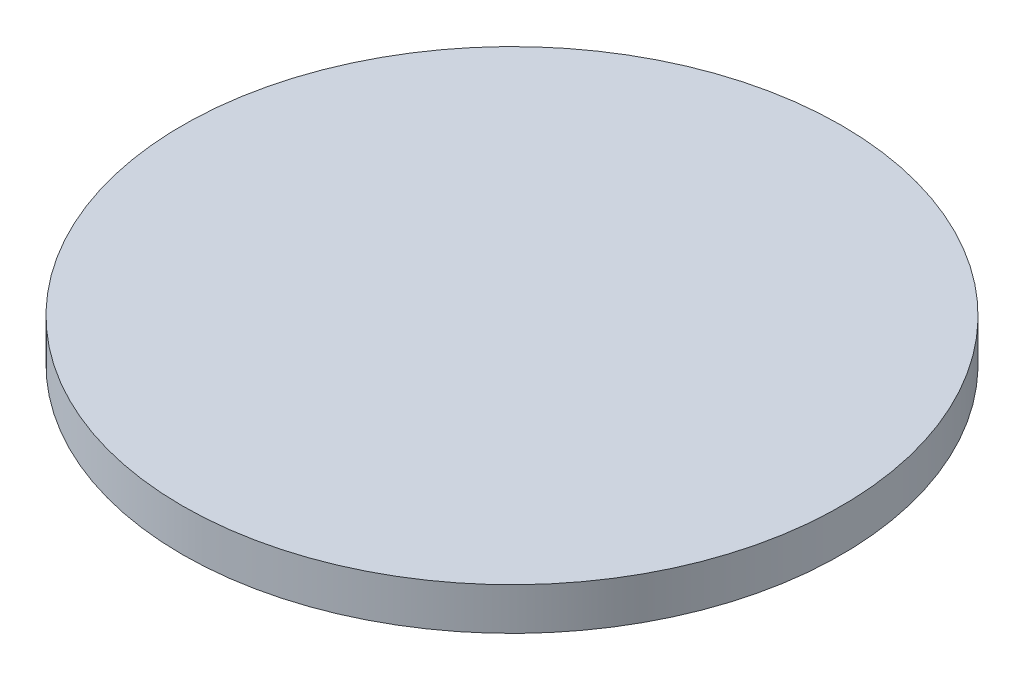
ISO-10303-21;
HEADER;
FILE_DESCRIPTION(('STEP AP214'),'2;1');
FILE_NAME('part.step','',(''),(''),'','','');
FILE_SCHEMA(('AUTOMOTIVE_DESIGN { 1 0 10303 214 1 1 1 1 }'));
ENDSEC;
DATA;
#1=APPLICATION_CONTEXT('core data for automotive mechanical design processes');
#2=APPLICATION_PROTOCOL_DEFINITION('international standard','automotive_design',2000,#1);
#3=PRODUCT_CONTEXT('',#1,'mechanical');
#4=PRODUCT('Part','Part','',(#3));
#5=PRODUCT_RELATED_PRODUCT_CATEGORY('part','',(#4));
#6=PRODUCT_DEFINITION_FORMATION('','',#4);
#7=PRODUCT_DEFINITION_CONTEXT('part definition',#1,'design');
#8=PRODUCT_DEFINITION('design','',#6,#7);
#9=PRODUCT_DEFINITION_SHAPE('','',#8);
#10=(LENGTH_UNIT() NAMED_UNIT(*) SI_UNIT(.MILLI.,.METRE.));
#11=(NAMED_UNIT(*) PLANE_ANGLE_UNIT() SI_UNIT($,.RADIAN.));
#12=(NAMED_UNIT(*) SI_UNIT($,.STERADIAN.) SOLID_ANGLE_UNIT());
#13=UNCERTAINTY_MEASURE_WITH_UNIT(LENGTH_MEASURE(1.E-05),#10,'distance_accuracy_value','');
#14=(GEOMETRIC_REPRESENTATION_CONTEXT(3) GLOBAL_UNCERTAINTY_ASSIGNED_CONTEXT((#13)) GLOBAL_UNIT_ASSIGNED_CONTEXT((#10,
#11,#12)) REPRESENTATION_CONTEXT('',''));
#15=CARTESIAN_POINT('',(0.,0.,0.));
#16=DIRECTION('',(0.,0.,1.));
#17=DIRECTION('',(1.,0.,0.));
#18=AXIS2_PLACEMENT_3D('',#15,#16,#17);
#19=CARTESIAN_POINT('',(0.,-5.,0.));
#20=DIRECTION('',(0.,1.,0.));
#21=DIRECTION('',(0.,0.,1.));
#22=AXIS2_PLACEMENT_3D('',#19,#20,#21);
#23=CYLINDRICAL_SURFACE('',#22,62.5);
#24=CARTESIAN_POINT('',(0.,-5.,0.));
#25=DIRECTION('',(0.,1.,0.));
#26=DIRECTION('',(0.,0.,1.));
#27=AXIS2_PLACEMENT_3D('',#24,#25,#26);
#28=CIRCLE('',#27,62.5);
#29=CARTESIAN_POINT('',(0.,-5.,62.5));
#30=VERTEX_POINT('',#29);
#31=EDGE_CURVE('E10',#30,#30,#28,.T.);
#32=ORIENTED_EDGE('',*,*,#31,.T.);
#33=EDGE_LOOP('',(#32));
#34=FACE_BOUND('',#33,.T.);
#35=CARTESIAN_POINT('',(0.,3.,0.));
#36=DIRECTION('',(0.,1.,0.));
#37=DIRECTION('',(0.,0.,1.));
#38=AXIS2_PLACEMENT_3D('',#35,#36,#37);
#39=CIRCLE('',#38,62.5);
#40=CARTESIAN_POINT('',(0.,3.,62.5));
#41=VERTEX_POINT('',#40);
#42=EDGE_CURVE('E51',#41,#41,#39,.T.);
#43=ORIENTED_EDGE('',*,*,#42,.F.);
#44=EDGE_LOOP('',(#43));
#45=FACE_BOUND('',#44,.T.);
#46=ADVANCED_FACE('F30',(#34,#45),#23,.T.);
#47=CARTESIAN_POINT('',(0.,-5.,0.));
#48=DIRECTION('',(0.,1.,0.));
#49=DIRECTION('',(0.,0.,1.));
#50=AXIS2_PLACEMENT_3D('',#47,#48,#49);
#51=PLANE('',#50);
#52=CARTESIAN_POINT('',(-22.041946960967,-5.,-30.3381372890583));
#53=DIRECTION('',(0.,1.,0.));
#54=DIRECTION('',(0.,0.,1.));
#55=AXIS2_PLACEMENT_3D('',#52,#53,#54);
#56=CIRCLE('',#55,11.25);
#57=CARTESIAN_POINT('',(-22.041946960967,-5.,-19.0881372890583));
#58=VERTEX_POINT('',#57);
#59=EDGE_CURVE('E61',#58,#58,#56,.T.);
#60=ORIENTED_EDGE('',*,*,#59,.T.);
#61=EDGE_LOOP('',(#60));
#62=FACE_BOUND('',#61,.T.);
#63=CARTESIAN_POINT('',(-35.6646193610656,-5.,-11.5881372890569));
#64=DIRECTION('',(0.,1.,0.));
#65=DIRECTION('',(0.,0.,1.));
#66=AXIS2_PLACEMENT_3D('',#63,#64,#65);
#67=CIRCLE('',#66,11.25);
#68=CARTESIAN_POINT('',(-35.6646193610656,-5.,-0.338137289056876));
#69=VERTEX_POINT('',#68);
#70=EDGE_CURVE('E64',#69,#69,#67,.T.);
#71=ORIENTED_EDGE('',*,*,#70,.T.);
#72=EDGE_LOOP('',(#71));
#73=FACE_BOUND('',#72,.T.);
#74=CARTESIAN_POINT('',(-35.6646193610633,-5.,11.5881372890642));
#75=DIRECTION('',(0.,1.,0.));
#76=DIRECTION('',(0.,0.,1.));
#77=AXIS2_PLACEMENT_3D('',#74,#75,#76);
#78=CIRCLE('',#77,11.25);
#79=CARTESIAN_POINT('',(-35.6646193610633,-5.,22.8381372890642));
#80=VERTEX_POINT('',#79);
#81=EDGE_CURVE('E71',#80,#80,#78,.T.);
#82=ORIENTED_EDGE('',*,*,#81,.T.);
#83=EDGE_LOOP('',(#82));
#84=FACE_BOUND('',#83,.T.);
#85=CARTESIAN_POINT('',(-22.0419469609608,-5.,30.3381372890628));
#86=DIRECTION('',(0.,1.,0.));
#87=DIRECTION('',(0.,0.,1.));
#88=AXIS2_PLACEMENT_3D('',#85,#86,#87);
#89=CIRCLE('',#88,11.25);
#90=CARTESIAN_POINT('',(-22.0419469609608,-5.,41.5881372890628));
#91=VERTEX_POINT('',#90);
#92=EDGE_CURVE('E77',#91,#91,#89,.T.);
#93=ORIENTED_EDGE('',*,*,#92,.T.);
#94=EDGE_LOOP('',(#93));
#95=FACE_BOUND('',#94,.T.);
#96=CARTESIAN_POINT('',(7.65641032932123E-12,-5.,37.5));
#97=DIRECTION('',(0.,1.,0.));
#98=DIRECTION('',(0.,0.,1.));
#99=AXIS2_PLACEMENT_3D('',#96,#97,#98);
#100=CIRCLE('',#99,11.25);
#101=CARTESIAN_POINT('',(7.65641032932123E-12,-5.,48.75));
#102=VERTEX_POINT('',#101);
#103=EDGE_CURVE('E83',#102,#102,#100,.T.);
#104=ORIENTED_EDGE('',*,*,#103,.T.);
#105=EDGE_LOOP('',(#104));
#106=FACE_BOUND('',#105,.T.);
#107=CARTESIAN_POINT('',(22.0419469609747,-5.,30.3381372890583));
#108=DIRECTION('',(0.,1.,0.));
#109=DIRECTION('',(0.,0.,1.));
#110=AXIS2_PLACEMENT_3D('',#107,#108,#109);
#111=CIRCLE('',#110,11.25);
#112=CARTESIAN_POINT('',(22.0419469609747,-5.,41.5881372890583));
#113=VERTEX_POINT('',#112);
#114=EDGE_CURVE('E89',#113,#113,#111,.T.);
#115=ORIENTED_EDGE('',*,*,#114,.T.);
#116=EDGE_LOOP('',(#115));
#117=FACE_BOUND('',#116,.T.);
#118=CARTESIAN_POINT('',(35.6646193610733,-5.,11.5881372890569));
#119=DIRECTION('',(0.,1.,0.));
#120=DIRECTION('',(0.,0.,1.));
#121=AXIS2_PLACEMENT_3D('',#118,#119,#120);
#122=CIRCLE('',#121,11.25);
#123=CARTESIAN_POINT('',(35.6646193610733,-5.,22.8381372890569));
#124=VERTEX_POINT('',#123);
#125=EDGE_CURVE('E95',#124,#124,#122,.T.);
#126=ORIENTED_EDGE('',*,*,#125,.T.);
#127=EDGE_LOOP('',(#126));
#128=FACE_BOUND('',#127,.T.);
#129=CARTESIAN_POINT('',(35.6646193610709,-5.,-11.5881372890642));
#130=DIRECTION('',(0.,1.,0.));
#131=DIRECTION('',(0.,0.,1.));
#132=AXIS2_PLACEMENT_3D('',#129,#130,#131);
#133=CIRCLE('',#132,11.25);
#134=CARTESIAN_POINT('',(35.6646193610709,-5.,-0.338137289064164));
#135=VERTEX_POINT('',#134);
#136=EDGE_CURVE('E101',#135,#135,#133,.T.);
#137=ORIENTED_EDGE('',*,*,#136,.T.);
#138=EDGE_LOOP('',(#137));
#139=FACE_BOUND('',#138,.T.);
#140=CARTESIAN_POINT('',(22.0419469609685,-5.,-30.3381372890628));
#141=DIRECTION('',(0.,1.,0.));
#142=DIRECTION('',(0.,0.,1.));
#143=AXIS2_PLACEMENT_3D('',#140,#141,#142);
#144=CIRCLE('',#143,11.25);
#145=CARTESIAN_POINT('',(22.0419469609685,-5.,-19.0881372890628));
#146=VERTEX_POINT('',#145);
#147=EDGE_CURVE('E45',#146,#146,#144,.T.);
#148=ORIENTED_EDGE('',*,*,#147,.T.);
#149=EDGE_LOOP('',(#148));
#150=FACE_BOUND('',#149,.T.);
#151=CARTESIAN_POINT('',(0.,-5.,-37.5));
#152=DIRECTION('',(0.,1.,0.));
#153=DIRECTION('',(0.,0.,1.));
#154=AXIS2_PLACEMENT_3D('',#151,#152,#153);
#155=CIRCLE('',#154,11.25);
#156=CARTESIAN_POINT('',(0.,-5.,-26.25));
#157=VERTEX_POINT('',#156);
#158=EDGE_CURVE('E40',#157,#157,#155,.T.);
#159=ORIENTED_EDGE('',*,*,#158,.T.);
#160=EDGE_LOOP('',(#159));
#161=FACE_BOUND('',#160,.T.);
#162=CARTESIAN_POINT('',(0.,-5.,0.));
#163=DIRECTION('',(0.,1.,0.));
#164=DIRECTION('',(0.,0.,1.));
#165=AXIS2_PLACEMENT_3D('',#162,#163,#164);
#166=CIRCLE('',#165,25.25);
#167=CARTESIAN_POINT('',(0.,-5.,25.25));
#168=VERTEX_POINT('',#167);
#169=EDGE_CURVE('E36',#168,#168,#166,.T.);
#170=ORIENTED_EDGE('',*,*,#169,.T.);
#171=EDGE_LOOP('',(#170));
#172=FACE_BOUND('',#171,.T.);
#173=ORIENTED_EDGE('',*,*,#31,.F.);
#174=EDGE_LOOP('',(#173));
#175=FACE_BOUND('',#174,.T.);
#176=ADVANCED_FACE('F133',(#62,#73,#84,#95,#106,#117,#128,#139,#150,#161,#172,#175),#51,.F.);
#177=CARTESIAN_POINT('',(0.,-5.,0.));
#178=DIRECTION('',(0.,1.,0.));
#179=DIRECTION('',(0.,0.,1.));
#180=AXIS2_PLACEMENT_3D('',#177,#178,#179);
#181=CYLINDRICAL_SURFACE('',#180,25.25);
#182=ORIENTED_EDGE('',*,*,#169,.F.);
#183=EDGE_LOOP('',(#182));
#184=FACE_BOUND('',#183,.T.);
#185=CARTESIAN_POINT('',(0.,0.,0.));
#186=DIRECTION('',(0.,1.,0.));
#187=DIRECTION('',(0.,0.,1.));
#188=AXIS2_PLACEMENT_3D('',#185,#186,#187);
#189=CIRCLE('',#188,25.25);
#190=CARTESIAN_POINT('',(0.,0.,25.25));
#191=VERTEX_POINT('',#190);
#192=EDGE_CURVE('E49',#191,#191,#189,.T.);
#193=ORIENTED_EDGE('',*,*,#192,.T.);
#194=EDGE_LOOP('',(#193));
#195=FACE_BOUND('',#194,.T.);
#196=ADVANCED_FACE('F137',(#184,#195),#181,.F.);
#197=CARTESIAN_POINT('',(0.,-5.,-37.5));
#198=DIRECTION('',(0.,1.,0.));
#199=DIRECTION('',(0.,0.,1.));
#200=AXIS2_PLACEMENT_3D('',#197,#198,#199);
#201=CYLINDRICAL_SURFACE('',#200,11.25);
#202=ORIENTED_EDGE('',*,*,#158,.F.);
#203=EDGE_LOOP('',(#202));
#204=FACE_BOUND('',#203,.T.);
#205=CARTESIAN_POINT('',(0.,0.,-37.5));
#206=DIRECTION('',(0.,1.,0.));
#207=DIRECTION('',(0.,0.,1.));
#208=AXIS2_PLACEMENT_3D('',#205,#206,#207);
#209=CIRCLE('',#208,11.25);
#210=CARTESIAN_POINT('',(0.,0.,-26.25));
#211=VERTEX_POINT('',#210);
#212=EDGE_CURVE('E48',#211,#211,#209,.T.);
#213=ORIENTED_EDGE('',*,*,#212,.T.);
#214=EDGE_LOOP('',(#213));
#215=FACE_BOUND('',#214,.T.);
#216=ADVANCED_FACE('F143',(#204,#215),#201,.F.);
#217=CARTESIAN_POINT('',(22.0419469609685,-5.,-30.3381372890628));
#218=DIRECTION('',(0.,1.,0.));
#219=DIRECTION('',(0.,0.,1.));
#220=AXIS2_PLACEMENT_3D('',#217,#218,#219);
#221=CYLINDRICAL_SURFACE('',#220,11.25);
#222=ORIENTED_EDGE('',*,*,#147,.F.);
#223=EDGE_LOOP('',(#222));
#224=FACE_BOUND('',#223,.T.);
#225=CARTESIAN_POINT('',(22.0419469609685,0.,-30.3381372890628));
#226=DIRECTION('',(0.,1.,0.));
#227=DIRECTION('',(0.,0.,1.));
#228=AXIS2_PLACEMENT_3D('',#225,#226,#227);
#229=CIRCLE('',#228,11.25);
#230=CARTESIAN_POINT('',(22.0419469609685,0.,-19.0881372890628));
#231=VERTEX_POINT('',#230);
#232=EDGE_CURVE('E55',#231,#231,#229,.T.);
#233=ORIENTED_EDGE('',*,*,#232,.T.);
#234=EDGE_LOOP('',(#233));
#235=FACE_BOUND('',#234,.T.);
#236=ADVANCED_FACE('F114',(#224,#235),#221,.F.);
#237=CARTESIAN_POINT('',(35.6646193610709,-5.,-11.5881372890642));
#238=DIRECTION('',(0.,1.,0.));
#239=DIRECTION('',(0.,0.,1.));
#240=AXIS2_PLACEMENT_3D('',#237,#238,#239);
#241=CYLINDRICAL_SURFACE('',#240,11.25);
#242=ORIENTED_EDGE('',*,*,#136,.F.);
#243=EDGE_LOOP('',(#242));
#244=FACE_BOUND('',#243,.T.);
#245=CARTESIAN_POINT('',(35.6646193610709,0.,-11.5881372890642));
#246=DIRECTION('',(0.,1.,0.));
#247=DIRECTION('',(0.,0.,1.));
#248=AXIS2_PLACEMENT_3D('',#245,#246,#247);
#249=CIRCLE('',#248,11.25);
#250=CARTESIAN_POINT('',(35.6646193610709,0.,-0.338137289064164));
#251=VERTEX_POINT('',#250);
#252=EDGE_CURVE('E104',#251,#251,#249,.T.);
#253=ORIENTED_EDGE('',*,*,#252,.T.);
#254=EDGE_LOOP('',(#253));
#255=FACE_BOUND('',#254,.T.);
#256=ADVANCED_FACE('F153',(#244,#255),#241,.F.);
#257=CARTESIAN_POINT('',(35.6646193610733,-5.,11.5881372890569));
#258=DIRECTION('',(0.,1.,0.));
#259=DIRECTION('',(0.,0.,1.));
#260=AXIS2_PLACEMENT_3D('',#257,#258,#259);
#261=CYLINDRICAL_SURFACE('',#260,11.25);
#262=ORIENTED_EDGE('',*,*,#125,.F.);
#263=EDGE_LOOP('',(#262));
#264=FACE_BOUND('',#263,.T.);
#265=CARTESIAN_POINT('',(35.6646193610733,0.,11.5881372890569));
#266=DIRECTION('',(0.,1.,0.));
#267=DIRECTION('',(0.,0.,1.));
#268=AXIS2_PLACEMENT_3D('',#265,#266,#267);
#269=CIRCLE('',#268,11.25);
#270=CARTESIAN_POINT('',(35.6646193610733,0.,22.8381372890569));
#271=VERTEX_POINT('',#270);
#272=EDGE_CURVE('E98',#271,#271,#269,.T.);
#273=ORIENTED_EDGE('',*,*,#272,.T.);
#274=EDGE_LOOP('',(#273));
#275=FACE_BOUND('',#274,.T.);
#276=ADVANCED_FACE('F157',(#264,#275),#261,.F.);
#277=CARTESIAN_POINT('',(22.0419469609747,-5.,30.3381372890583));
#278=DIRECTION('',(0.,1.,0.));
#279=DIRECTION('',(0.,0.,1.));
#280=AXIS2_PLACEMENT_3D('',#277,#278,#279);
#281=CYLINDRICAL_SURFACE('',#280,11.25);
#282=ORIENTED_EDGE('',*,*,#114,.F.);
#283=EDGE_LOOP('',(#282));
#284=FACE_BOUND('',#283,.T.);
#285=CARTESIAN_POINT('',(22.0419469609747,0.,30.3381372890583));
#286=DIRECTION('',(0.,1.,0.));
#287=DIRECTION('',(0.,0.,1.));
#288=AXIS2_PLACEMENT_3D('',#285,#286,#287);
#289=CIRCLE('',#288,11.25);
#290=CARTESIAN_POINT('',(22.0419469609747,0.,41.5881372890583));
#291=VERTEX_POINT('',#290);
#292=EDGE_CURVE('E92',#291,#291,#289,.T.);
#293=ORIENTED_EDGE('',*,*,#292,.T.);
#294=EDGE_LOOP('',(#293));
#295=FACE_BOUND('',#294,.T.);
#296=ADVANCED_FACE('F161',(#284,#295),#281,.F.);
#297=CARTESIAN_POINT('',(7.65641032932123E-12,-5.,37.5));
#298=DIRECTION('',(0.,1.,0.));
#299=DIRECTION('',(0.,0.,1.));
#300=AXIS2_PLACEMENT_3D('',#297,#298,#299);
#301=CYLINDRICAL_SURFACE('',#300,11.25);
#302=ORIENTED_EDGE('',*,*,#103,.F.);
#303=EDGE_LOOP('',(#302));
#304=FACE_BOUND('',#303,.T.);
#305=CARTESIAN_POINT('',(7.65641032932123E-12,0.,37.5));
#306=DIRECTION('',(0.,1.,0.));
#307=DIRECTION('',(0.,0.,1.));
#308=AXIS2_PLACEMENT_3D('',#305,#306,#307);
#309=CIRCLE('',#308,11.25);
#310=CARTESIAN_POINT('',(7.65641032932123E-12,0.,48.75));
#311=VERTEX_POINT('',#310);
#312=EDGE_CURVE('E86',#311,#311,#309,.T.);
#313=ORIENTED_EDGE('',*,*,#312,.T.);
#314=EDGE_LOOP('',(#313));
#315=FACE_BOUND('',#314,.T.);
#316=ADVANCED_FACE('F165',(#304,#315),#301,.F.);
#317=CARTESIAN_POINT('',(-22.0419469609608,-5.,30.3381372890628));
#318=DIRECTION('',(0.,1.,0.));
#319=DIRECTION('',(0.,0.,1.));
#320=AXIS2_PLACEMENT_3D('',#317,#318,#319);
#321=CYLINDRICAL_SURFACE('',#320,11.25);
#322=ORIENTED_EDGE('',*,*,#92,.F.);
#323=EDGE_LOOP('',(#322));
#324=FACE_BOUND('',#323,.T.);
#325=CARTESIAN_POINT('',(-22.0419469609608,0.,30.3381372890628));
#326=DIRECTION('',(0.,1.,0.));
#327=DIRECTION('',(0.,0.,1.));
#328=AXIS2_PLACEMENT_3D('',#325,#326,#327);
#329=CIRCLE('',#328,11.25);
#330=CARTESIAN_POINT('',(-22.0419469609608,0.,41.5881372890628));
#331=VERTEX_POINT('',#330);
#332=EDGE_CURVE('E80',#331,#331,#329,.T.);
#333=ORIENTED_EDGE('',*,*,#332,.T.);
#334=EDGE_LOOP('',(#333));
#335=FACE_BOUND('',#334,.T.);
#336=ADVANCED_FACE('F169',(#324,#335),#321,.F.);
#337=CARTESIAN_POINT('',(-35.6646193610633,-5.,11.5881372890642));
#338=DIRECTION('',(0.,1.,0.));
#339=DIRECTION('',(0.,0.,1.));
#340=AXIS2_PLACEMENT_3D('',#337,#338,#339);
#341=CYLINDRICAL_SURFACE('',#340,11.25);
#342=ORIENTED_EDGE('',*,*,#81,.F.);
#343=EDGE_LOOP('',(#342));
#344=FACE_BOUND('',#343,.T.);
#345=CARTESIAN_POINT('',(-35.6646193610633,0.,11.5881372890642));
#346=DIRECTION('',(0.,1.,0.));
#347=DIRECTION('',(0.,0.,1.));
#348=AXIS2_PLACEMENT_3D('',#345,#346,#347);
#349=CIRCLE('',#348,11.25);
#350=CARTESIAN_POINT('',(-35.6646193610633,0.,22.8381372890642));
#351=VERTEX_POINT('',#350);
#352=EDGE_CURVE('E74',#351,#351,#349,.T.);
#353=ORIENTED_EDGE('',*,*,#352,.T.);
#354=EDGE_LOOP('',(#353));
#355=FACE_BOUND('',#354,.T.);
#356=ADVANCED_FACE('F173',(#344,#355),#341,.F.);
#357=CARTESIAN_POINT('',(-35.6646193610656,-5.,-11.5881372890569));
#358=DIRECTION('',(0.,1.,0.));
#359=DIRECTION('',(0.,0.,1.));
#360=AXIS2_PLACEMENT_3D('',#357,#358,#359);
#361=CYLINDRICAL_SURFACE('',#360,11.25);
#362=ORIENTED_EDGE('',*,*,#70,.F.);
#363=EDGE_LOOP('',(#362));
#364=FACE_BOUND('',#363,.T.);
#365=CARTESIAN_POINT('',(-35.6646193610656,0.,-11.5881372890569));
#366=DIRECTION('',(0.,1.,0.));
#367=DIRECTION('',(0.,0.,1.));
#368=AXIS2_PLACEMENT_3D('',#365,#366,#367);
#369=CIRCLE('',#368,11.25);
#370=CARTESIAN_POINT('',(-35.6646193610656,0.,-0.338137289056876));
#371=VERTEX_POINT('',#370);
#372=EDGE_CURVE('E68',#371,#371,#369,.T.);
#373=ORIENTED_EDGE('',*,*,#372,.T.);
#374=EDGE_LOOP('',(#373));
#375=FACE_BOUND('',#374,.T.);
#376=ADVANCED_FACE('F177',(#364,#375),#361,.F.);
#377=CARTESIAN_POINT('',(-22.041946960967,-5.,-30.3381372890583));
#378=DIRECTION('',(0.,1.,0.));
#379=DIRECTION('',(0.,0.,1.));
#380=AXIS2_PLACEMENT_3D('',#377,#378,#379);
#381=CYLINDRICAL_SURFACE('',#380,11.25);
#382=ORIENTED_EDGE('',*,*,#59,.F.);
#383=EDGE_LOOP('',(#382));
#384=FACE_BOUND('',#383,.T.);
#385=CARTESIAN_POINT('',(-22.041946960967,0.,-30.3381372890583));
#386=DIRECTION('',(0.,1.,0.));
#387=DIRECTION('',(0.,0.,1.));
#388=AXIS2_PLACEMENT_3D('',#385,#386,#387);
#389=CIRCLE('',#388,11.25);
#390=CARTESIAN_POINT('',(-22.041946960967,0.,-19.0881372890583));
#391=VERTEX_POINT('',#390);
#392=EDGE_CURVE('E65',#391,#391,#389,.T.);
#393=ORIENTED_EDGE('',*,*,#392,.T.);
#394=EDGE_LOOP('',(#393));
#395=FACE_BOUND('',#394,.T.);
#396=ADVANCED_FACE('F180',(#384,#395),#381,.F.);
#397=CARTESIAN_POINT('',(0.,0.,0.));
#398=DIRECTION('',(0.,1.,0.));
#399=DIRECTION('',(0.,0.,1.));
#400=AXIS2_PLACEMENT_3D('',#397,#398,#399);
#401=PLANE('',#400);
#402=ORIENTED_EDGE('',*,*,#192,.F.);
#403=EDGE_LOOP('',(#402));
#404=FACE_BOUND('',#403,.T.);
#405=ADVANCED_FACE('F127',(#404),#401,.F.);
#406=ORIENTED_EDGE('',*,*,#212,.F.);
#407=EDGE_LOOP('',(#406));
#408=FACE_BOUND('',#407,.T.);
#409=ADVANCED_FACE('F119',(#408),#401,.F.);
#410=ORIENTED_EDGE('',*,*,#232,.F.);
#411=EDGE_LOOP('',(#410));
#412=FACE_BOUND('',#411,.T.);
#413=ADVANCED_FACE('F116',(#412),#401,.F.);
#414=ORIENTED_EDGE('',*,*,#252,.F.);
#415=EDGE_LOOP('',(#414));
#416=FACE_BOUND('',#415,.T.);
#417=ADVANCED_FACE('F118',(#416),#401,.F.);
#418=ORIENTED_EDGE('',*,*,#272,.F.);
#419=EDGE_LOOP('',(#418));
#420=FACE_BOUND('',#419,.T.);
#421=ADVANCED_FACE('F125',(#420),#401,.F.);
#422=ORIENTED_EDGE('',*,*,#292,.F.);
#423=EDGE_LOOP('',(#422));
#424=FACE_BOUND('',#423,.T.);
#425=ADVANCED_FACE('F218',(#424),#401,.F.);
#426=ORIENTED_EDGE('',*,*,#312,.F.);
#427=EDGE_LOOP('',(#426));
#428=FACE_BOUND('',#427,.T.);
#429=ADVANCED_FACE('F211',(#428),#401,.F.);
#430=ORIENTED_EDGE('',*,*,#332,.F.);
#431=EDGE_LOOP('',(#430));
#432=FACE_BOUND('',#431,.T.);
#433=ADVANCED_FACE('F204',(#432),#401,.F.);
#434=ORIENTED_EDGE('',*,*,#352,.F.);
#435=EDGE_LOOP('',(#434));
#436=FACE_BOUND('',#435,.T.);
#437=ADVANCED_FACE('F199',(#436),#401,.F.);
#438=ORIENTED_EDGE('',*,*,#372,.F.);
#439=EDGE_LOOP('',(#438));
#440=FACE_BOUND('',#439,.T.);
#441=ADVANCED_FACE('F194',(#440),#401,.F.);
#442=ORIENTED_EDGE('',*,*,#392,.F.);
#443=EDGE_LOOP('',(#442));
#444=FACE_BOUND('',#443,.T.);
#445=ADVANCED_FACE('F129',(#444),#401,.F.);
#446=CARTESIAN_POINT('',(0.,3.,0.));
#447=DIRECTION('',(0.,1.,0.));
#448=DIRECTION('',(0.,0.,1.));
#449=AXIS2_PLACEMENT_3D('',#446,#447,#448);
#450=PLANE('',#449);
#451=ORIENTED_EDGE('',*,*,#42,.T.);
#452=EDGE_LOOP('',(#451));
#453=FACE_BOUND('',#452,.T.);
#454=ADVANCED_FACE('F193',(#453),#450,.T.);
#455=CLOSED_SHELL('',(#46,#176,#196,#216,#236,#256,#276,#296,#316,#336,#356,#376,#396,#405,#409,
#413,#417,#421,#425,#429,#433,#437,#441,#445,#454));
#456=MANIFOLD_SOLID_BREP('B2',#455);
#457=ADVANCED_BREP_SHAPE_REPRESENTATION('',(#18,#456),#14);
#458=SHAPE_DEFINITION_REPRESENTATION(#9,#457);
ENDSEC;
END-ISO-10303-21;
